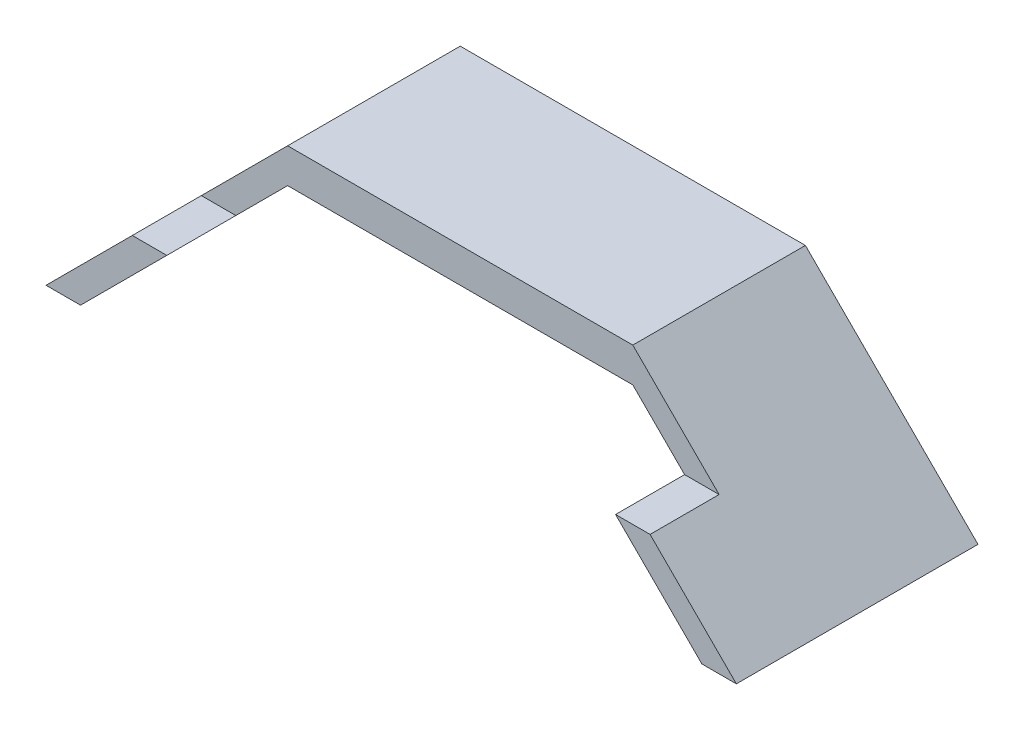
ISO-10303-21;
HEADER;
FILE_DESCRIPTION(('STEP AP214'),'2;1');
FILE_NAME('part.step','',(''),(''),'','','');
FILE_SCHEMA(('AUTOMOTIVE_DESIGN { 1 0 10303 214 1 1 1 1 }'));
ENDSEC;
DATA;
#1=APPLICATION_CONTEXT('core data for automotive mechanical design processes');
#2=APPLICATION_PROTOCOL_DEFINITION('international standard','automotive_design',2000,#1);
#3=PRODUCT_CONTEXT('',#1,'mechanical');
#4=PRODUCT('Part','Part','',(#3));
#5=PRODUCT_RELATED_PRODUCT_CATEGORY('part','',(#4));
#6=PRODUCT_DEFINITION_FORMATION('','',#4);
#7=PRODUCT_DEFINITION_CONTEXT('part definition',#1,'design');
#8=PRODUCT_DEFINITION('design','',#6,#7);
#9=PRODUCT_DEFINITION_SHAPE('','',#8);
#10=(LENGTH_UNIT() NAMED_UNIT(*) SI_UNIT(.MILLI.,.METRE.));
#11=(NAMED_UNIT(*) PLANE_ANGLE_UNIT() SI_UNIT($,.RADIAN.));
#12=(NAMED_UNIT(*) SI_UNIT($,.STERADIAN.) SOLID_ANGLE_UNIT());
#13=UNCERTAINTY_MEASURE_WITH_UNIT(LENGTH_MEASURE(1.E-05),#10,'distance_accuracy_value','');
#14=(GEOMETRIC_REPRESENTATION_CONTEXT(3) GLOBAL_UNCERTAINTY_ASSIGNED_CONTEXT((#13)) GLOBAL_UNIT_ASSIGNED_CONTEXT((#10,
#11,#12)) REPRESENTATION_CONTEXT('',''));
#15=CARTESIAN_POINT('',(0.,0.,0.));
#16=DIRECTION('',(0.,0.,1.));
#17=DIRECTION('',(1.,0.,0.));
#18=AXIS2_PLACEMENT_3D('',#15,#16,#17);
#19=CARTESIAN_POINT('',(-100.888329597959,66.3504106044676,70.));
#20=DIRECTION('',(0.,1.,0.));
#21=DIRECTION('',(-1.,0.,0.));
#22=AXIS2_PLACEMENT_3D('',#19,#20,#21);
#23=PLANE('',#22);
#24=DIRECTION('',(1.,0.,0.));
#25=VECTOR('',#24,1.);
#26=CARTESIAN_POINT('',(-100.888329597959,66.3504106044676,50.));
#27=LINE('',#26,#25);
#28=CARTESIAN_POINT('',(-100.888329597959,66.3504106044676,50.));
#29=VERTEX_POINT('',#28);
#30=CARTESIAN_POINT('',(-0.888329597958717,66.3504106044676,50.));
#31=VERTEX_POINT('',#30);
#32=EDGE_CURVE('E281',#29,#31,#27,.T.);
#33=ORIENTED_EDGE('',*,*,#32,.F.);
#34=DIRECTION('',(0.,0.,-1.));
#35=VECTOR('',#34,1.);
#36=CARTESIAN_POINT('',(-100.888329597959,66.3504106044676,70.));
#37=LINE('',#36,#35);
#38=CARTESIAN_POINT('',(-100.888329597959,66.3504106044676,0.));
#39=VERTEX_POINT('',#38);
#40=EDGE_CURVE('E11',#29,#39,#37,.T.);
#41=ORIENTED_EDGE('',*,*,#40,.T.);
#42=DIRECTION('',(1.,0.,0.));
#43=VECTOR('',#42,1.);
#44=CARTESIAN_POINT('',(-100.888329597959,66.3504106044676,0.));
#45=LINE('',#44,#43);
#46=CARTESIAN_POINT('',(-0.888329597958717,66.3504106044676,0.));
#47=VERTEX_POINT('',#46);
#48=EDGE_CURVE('E191',#39,#47,#45,.T.);
#49=ORIENTED_EDGE('',*,*,#48,.T.);
#50=DIRECTION('',(0.,0.,-1.));
#51=VECTOR('',#50,1.);
#52=CARTESIAN_POINT('',(-0.888329597958717,66.3504106044676,70.));
#53=LINE('',#52,#51);
#54=EDGE_CURVE('E47',#31,#47,#53,.T.);
#55=ORIENTED_EDGE('',*,*,#54,.F.);
#56=EDGE_LOOP('',(#33,#41,#49,#55));
#57=FACE_BOUND('',#56,.T.);
#58=ADVANCED_FACE('F38',(#57),#23,.F.);
#59=CARTESIAN_POINT('',(-100.888333902289,76.3504106044676,70.));
#60=DIRECTION('',(0.,-1.,0.));
#61=DIRECTION('',(0.,0.,-1.));
#62=AXIS2_PLACEMENT_3D('',#59,#60,#61);
#63=PLANE('',#62);
#64=DIRECTION('',(-1.,0.,0.));
#65=VECTOR('',#64,1.);
#66=CARTESIAN_POINT('',(-100.888333902289,76.3504106044676,50.));
#67=LINE('',#66,#65);
#68=CARTESIAN_POINT('',(-0.888333902288513,76.3504106044676,50.));
#69=VERTEX_POINT('',#68);
#70=CARTESIAN_POINT('',(-100.888333902289,76.3504106044676,50.));
#71=VERTEX_POINT('',#70);
#72=EDGE_CURVE('E150',#69,#71,#67,.T.);
#73=ORIENTED_EDGE('',*,*,#72,.F.);
#74=DIRECTION('',(0.,0.,-1.));
#75=VECTOR('',#74,1.);
#76=CARTESIAN_POINT('',(-0.888333902288513,76.3504106044676,70.));
#77=LINE('',#76,#75);
#78=CARTESIAN_POINT('',(-0.888333902288513,76.3504106044676,0.));
#79=VERTEX_POINT('',#78);
#80=EDGE_CURVE('E223',#69,#79,#77,.T.);
#81=ORIENTED_EDGE('',*,*,#80,.T.);
#82=DIRECTION('',(-1.,0.,0.));
#83=VECTOR('',#82,1.);
#84=CARTESIAN_POINT('',(-100.888333902289,76.3504106044676,0.));
#85=LINE('',#84,#83);
#86=CARTESIAN_POINT('',(-100.888333902289,76.3504106044676,0.));
#87=VERTEX_POINT('',#86);
#88=EDGE_CURVE('E206',#79,#87,#85,.T.);
#89=ORIENTED_EDGE('',*,*,#88,.T.);
#90=DIRECTION('',(0.,0.,-1.));
#91=VECTOR('',#90,1.);
#92=CARTESIAN_POINT('',(-100.888333902289,76.3504106044676,70.));
#93=LINE('',#92,#91);
#94=EDGE_CURVE('E220',#71,#87,#93,.T.);
#95=ORIENTED_EDGE('',*,*,#94,.F.);
#96=EDGE_LOOP('',(#73,#81,#89,#95));
#97=FACE_BOUND('',#96,.T.);
#98=ADVANCED_FACE('F303',(#97),#63,.F.);
#99=CARTESIAN_POINT('',(0.,0.,70.));
#100=DIRECTION('',(0.,0.,-1.));
#101=DIRECTION('',(-1.,0.,0.));
#102=AXIS2_PLACEMENT_3D('',#99,#100,#101);
#103=PLANE('',#102);
#104=DIRECTION('',(-0.707106811622753,0.70710675075034,0.));
#105=VECTOR('',#104,1.);
#106=CARTESIAN_POINT('',(49.1116704020413,26.3504106044676,70.));
#107=LINE('',#106,#105);
#108=CARTESIAN_POINT('',(49.1116704020413,26.3504106044676,70.));
#109=VERTEX_POINT('',#108);
#110=CARTESIAN_POINT('',(24.1116693259588,51.35041168055,70.));
#111=VERTEX_POINT('',#110);
#112=EDGE_CURVE('E178',#109,#111,#107,.T.);
#113=ORIENTED_EDGE('',*,*,#112,.T.);
#114=DIRECTION('',(1.,0.,0.));
#115=VECTOR('',#114,1.);
#116=CARTESIAN_POINT('',(14.1116693259588,51.35041168055,70.));
#117=LINE('',#116,#115);
#118=CARTESIAN_POINT('',(14.1116693259588,51.35041168055,70.));
#119=VERTEX_POINT('',#118);
#120=EDGE_CURVE('E154',#119,#111,#117,.T.);
#121=ORIENTED_EDGE('',*,*,#120,.F.);
#122=DIRECTION('',(0.707106781186547,-0.707106781186548,0.));
#123=VECTOR('',#122,1.);
#124=CARTESIAN_POINT('',(-0.888329597958717,66.3504106044676,70.));
#125=LINE('',#124,#123);
#126=CARTESIAN_POINT('',(39.1116704020413,26.3504106044676,70.));
#127=VERTEX_POINT('',#126);
#128=EDGE_CURVE('E103',#119,#127,#125,.T.);
#129=ORIENTED_EDGE('',*,*,#128,.T.);
#130=DIRECTION('',(1.,0.,0.));
#131=VECTOR('',#130,1.);
#132=CARTESIAN_POINT('',(39.1116704020413,26.3504106044676,70.));
#133=LINE('',#132,#131);
#134=EDGE_CURVE('E175',#127,#109,#133,.T.);
#135=ORIENTED_EDGE('',*,*,#134,.T.);
#136=EDGE_LOOP('',(#113,#121,#129,#135));
#137=FACE_BOUND('',#136,.T.);
#138=ADVANCED_FACE('F262',(#137),#103,.F.);
#139=CARTESIAN_POINT('',(-140.888329597959,26.3504106044676,70.));
#140=DIRECTION('',(-0.707106781186548,0.707106781186548,0.));
#141=DIRECTION('',(-0.707106781186548,-0.707106781186548,0.));
#142=AXIS2_PLACEMENT_3D('',#139,#140,#141);
#143=PLANE('',#142);
#144=DIRECTION('',(0.707106781186547,0.707106781186548,0.));
#145=VECTOR('',#144,1.);
#146=CARTESIAN_POINT('',(-100.888329597959,66.3504106044676,50.));
#147=LINE('',#146,#145);
#148=CARTESIAN_POINT('',(-115.888330674041,51.3504095283851,50.));
#149=VERTEX_POINT('',#148);
#150=EDGE_CURVE('E144',#149,#29,#147,.T.);
#151=ORIENTED_EDGE('',*,*,#150,.F.);
#152=DIRECTION('',(0.,0.,1.));
#153=VECTOR('',#152,1.);
#154=CARTESIAN_POINT('',(-115.888330674041,51.3504095283851,50.));
#155=LINE('',#154,#153);
#156=CARTESIAN_POINT('',(-115.888330674041,51.3504095283851,70.));
#157=VERTEX_POINT('',#156);
#158=EDGE_CURVE('E140',#149,#157,#155,.T.);
#159=ORIENTED_EDGE('',*,*,#158,.T.);
#160=DIRECTION('',(0.707106781186547,0.707106781186547,0.));
#161=VECTOR('',#160,1.);
#162=CARTESIAN_POINT('',(-140.888329597959,26.3504106044676,70.));
#163=LINE('',#162,#161);
#164=CARTESIAN_POINT('',(-140.888329597959,26.3504106044676,70.));
#165=VERTEX_POINT('',#164);
#166=EDGE_CURVE('E170',#165,#157,#163,.T.);
#167=ORIENTED_EDGE('',*,*,#166,.F.);
#168=DIRECTION('',(0.,0.,-1.));
#169=VECTOR('',#168,1.);
#170=CARTESIAN_POINT('',(-140.888329597959,26.3504106044676,70.));
#171=LINE('',#170,#169);
#172=CARTESIAN_POINT('',(-140.888329597959,26.3504106044676,0.));
#173=VERTEX_POINT('',#172);
#174=EDGE_CURVE('E186',#165,#173,#171,.T.);
#175=ORIENTED_EDGE('',*,*,#174,.T.);
#176=DIRECTION('',(0.707106781186547,0.707106781186547,0.));
#177=VECTOR('',#176,1.);
#178=CARTESIAN_POINT('',(-140.888329597959,26.3504106044676,0.));
#179=LINE('',#178,#177);
#180=EDGE_CURVE('E187',#173,#39,#179,.T.);
#181=ORIENTED_EDGE('',*,*,#180,.T.);
#182=ORIENTED_EDGE('',*,*,#40,.F.);
#183=EDGE_LOOP('',(#151,#159,#167,#175,#181,#182));
#184=FACE_BOUND('',#183,.T.);
#185=ADVANCED_FACE('F40',(#184),#143,.F.);
#186=CARTESIAN_POINT('',(-0.888329597958717,66.3504106044676,70.));
#187=DIRECTION('',(0.707106781186548,0.707106781186547,0.));
#188=DIRECTION('',(-0.707106781186547,0.707106781186548,0.));
#189=AXIS2_PLACEMENT_3D('',#186,#187,#188);
#190=PLANE('',#189);
#191=ORIENTED_EDGE('',*,*,#128,.F.);
#192=DIRECTION('',(0.,0.,1.));
#193=VECTOR('',#192,1.);
#194=CARTESIAN_POINT('',(14.1116693259588,51.35041168055,50.));
#195=LINE('',#194,#193);
#196=CARTESIAN_POINT('',(14.1116693259588,51.35041168055,50.));
#197=VERTEX_POINT('',#196);
#198=EDGE_CURVE('E164',#197,#119,#195,.T.);
#199=ORIENTED_EDGE('',*,*,#198,.F.);
#200=DIRECTION('',(0.707106781186548,-0.707106781186547,0.));
#201=VECTOR('',#200,1.);
#202=CARTESIAN_POINT('',(-0.888329597958717,66.3504106044676,50.));
#203=LINE('',#202,#201);
#204=EDGE_CURVE('E241',#31,#197,#203,.T.);
#205=ORIENTED_EDGE('',*,*,#204,.F.);
#206=ORIENTED_EDGE('',*,*,#54,.T.);
#207=DIRECTION('',(0.707106781186547,-0.707106781186548,0.));
#208=VECTOR('',#207,1.);
#209=CARTESIAN_POINT('',(-0.888329597958717,66.3504106044676,0.));
#210=LINE('',#209,#208);
#211=CARTESIAN_POINT('',(39.1116704020413,26.3504106044676,0.));
#212=VERTEX_POINT('',#211);
#213=EDGE_CURVE('E196',#47,#212,#210,.T.);
#214=ORIENTED_EDGE('',*,*,#213,.T.);
#215=DIRECTION('',(0.,0.,-1.));
#216=VECTOR('',#215,1.);
#217=CARTESIAN_POINT('',(39.1116704020413,26.3504106044676,70.));
#218=LINE('',#217,#216);
#219=EDGE_CURVE('E230',#127,#212,#218,.T.);
#220=ORIENTED_EDGE('',*,*,#219,.F.);
#221=EDGE_LOOP('',(#191,#199,#205,#206,#214,#220));
#222=FACE_BOUND('',#221,.T.);
#223=ADVANCED_FACE('F237',(#222),#190,.F.);
#224=CARTESIAN_POINT('',(39.1116704020413,26.3504106044676,70.));
#225=DIRECTION('',(0.,1.,0.));
#226=DIRECTION('',(0.,0.,1.));
#227=AXIS2_PLACEMENT_3D('',#224,#225,#226);
#228=PLANE('',#227);
#229=DIRECTION('',(1.,0.,0.));
#230=VECTOR('',#229,1.);
#231=CARTESIAN_POINT('',(39.1116704020413,26.3504106044676,0.));
#232=LINE('',#231,#230);
#233=CARTESIAN_POINT('',(49.1116704020413,26.3504106044676,0.));
#234=VERTEX_POINT('',#233);
#235=EDGE_CURVE('E199',#212,#234,#232,.T.);
#236=ORIENTED_EDGE('',*,*,#235,.T.);
#237=DIRECTION('',(0.,0.,-1.));
#238=VECTOR('',#237,1.);
#239=CARTESIAN_POINT('',(49.1116704020413,26.3504106044676,70.));
#240=LINE('',#239,#238);
#241=EDGE_CURVE('E226',#109,#234,#240,.T.);
#242=ORIENTED_EDGE('',*,*,#241,.F.);
#243=ORIENTED_EDGE('',*,*,#134,.F.);
#244=ORIENTED_EDGE('',*,*,#219,.T.);
#245=EDGE_LOOP('',(#236,#242,#243,#244));
#246=FACE_BOUND('',#245,.T.);
#247=ADVANCED_FACE('F254',(#246),#228,.F.);
#248=CARTESIAN_POINT('',(49.1116704020413,26.3504106044676,70.));
#249=DIRECTION('',(-0.70710675075034,-0.707106811622753,0.));
#250=DIRECTION('',(0.707106811622753,-0.70710675075034,0.));
#251=AXIS2_PLACEMENT_3D('',#248,#249,#250);
#252=PLANE('',#251);
#253=DIRECTION('',(-0.707106842058958,0.707106720314132,0.));
#254=VECTOR('',#253,1.);
#255=CARTESIAN_POINT('',(24.1116693259588,51.35041168055,50.));
#256=LINE('',#255,#254);
#257=CARTESIAN_POINT('',(24.1116693259588,51.35041168055,50.));
#258=VERTEX_POINT('',#257);
#259=EDGE_CURVE('E166',#258,#69,#256,.T.);
#260=ORIENTED_EDGE('',*,*,#259,.F.);
#261=DIRECTION('',(0.,0.,1.));
#262=VECTOR('',#261,1.);
#263=CARTESIAN_POINT('',(24.1116693259588,51.35041168055,50.));
#264=LINE('',#263,#262);
#265=EDGE_CURVE('E192',#258,#111,#264,.T.);
#266=ORIENTED_EDGE('',*,*,#265,.T.);
#267=ORIENTED_EDGE('',*,*,#112,.F.);
#268=ORIENTED_EDGE('',*,*,#241,.T.);
#269=DIRECTION('',(-0.707106811622753,0.70710675075034,0.));
#270=VECTOR('',#269,1.);
#271=CARTESIAN_POINT('',(49.1116704020413,26.3504106044676,0.));
#272=LINE('',#271,#270);
#273=EDGE_CURVE('E202',#234,#79,#272,.T.);
#274=ORIENTED_EDGE('',*,*,#273,.T.);
#275=ORIENTED_EDGE('',*,*,#80,.F.);
#276=EDGE_LOOP('',(#260,#266,#267,#268,#274,#275));
#277=FACE_BOUND('',#276,.T.);
#278=ADVANCED_FACE('F259',(#277),#252,.F.);
#279=CARTESIAN_POINT('',(-150.888329597959,26.3504106044676,70.));
#280=DIRECTION('',(0.707106811622756,-0.707106750750338,0.));
#281=DIRECTION('',(0.707106750750338,0.707106811622756,0.));
#282=AXIS2_PLACEMENT_3D('',#279,#280,#281);
#283=PLANE('',#282);
#284=DIRECTION('',(-0.707106750750338,-0.707106811622756,0.));
#285=VECTOR('',#284,1.);
#286=CARTESIAN_POINT('',(-150.888329597959,26.3504106044676,70.));
#287=LINE('',#286,#285);
#288=CARTESIAN_POINT('',(-125.888332826206,51.3504095283851,70.));
#289=VERTEX_POINT('',#288);
#290=CARTESIAN_POINT('',(-150.888329597959,26.3504106044676,70.));
#291=VERTEX_POINT('',#290);
#292=EDGE_CURVE('E159',#289,#291,#287,.T.);
#293=ORIENTED_EDGE('',*,*,#292,.F.);
#294=DIRECTION('',(0.,0.,1.));
#295=VECTOR('',#294,1.);
#296=CARTESIAN_POINT('',(-125.888330674041,51.3504095283851,50.));
#297=LINE('',#296,#295);
#298=CARTESIAN_POINT('',(-125.888330674041,51.3504095283851,50.));
#299=VERTEX_POINT('',#298);
#300=EDGE_CURVE('E54',#299,#289,#297,.T.);
#301=ORIENTED_EDGE('',*,*,#300,.F.);
#302=DIRECTION('',(-0.707106720314127,-0.707106842058963,0.));
#303=VECTOR('',#302,1.);
#304=CARTESIAN_POINT('',(-125.888330674041,51.3504095283851,50.));
#305=LINE('',#304,#303);
#306=EDGE_CURVE('E145',#71,#299,#305,.T.);
#307=ORIENTED_EDGE('',*,*,#306,.F.);
#308=ORIENTED_EDGE('',*,*,#94,.T.);
#309=DIRECTION('',(-0.707106750750338,-0.707106811622756,0.));
#310=VECTOR('',#309,1.);
#311=CARTESIAN_POINT('',(-150.888329597959,26.3504106044676,0.));
#312=LINE('',#311,#310);
#313=CARTESIAN_POINT('',(-150.888329597959,26.3504106044676,0.));
#314=VERTEX_POINT('',#313);
#315=EDGE_CURVE('E210',#87,#314,#312,.T.);
#316=ORIENTED_EDGE('',*,*,#315,.T.);
#317=DIRECTION('',(0.,0.,-1.));
#318=VECTOR('',#317,1.);
#319=CARTESIAN_POINT('',(-150.888329597959,26.3504106044676,70.));
#320=LINE('',#319,#318);
#321=EDGE_CURVE('E217',#291,#314,#320,.T.);
#322=ORIENTED_EDGE('',*,*,#321,.F.);
#323=EDGE_LOOP('',(#293,#301,#307,#308,#316,#322));
#324=FACE_BOUND('',#323,.T.);
#325=ADVANCED_FACE('F157',(#324),#283,.F.);
#326=CARTESIAN_POINT('',(-150.888329597959,26.3504106044676,70.));
#327=DIRECTION('',(0.,1.,0.));
#328=DIRECTION('',(0.,0.,1.));
#329=AXIS2_PLACEMENT_3D('',#326,#327,#328);
#330=PLANE('',#329);
#331=DIRECTION('',(1.,0.,0.));
#332=VECTOR('',#331,1.);
#333=CARTESIAN_POINT('',(-150.888329597959,26.3504106044676,0.));
#334=LINE('',#333,#332);
#335=EDGE_CURVE('E95',#314,#173,#334,.T.);
#336=ORIENTED_EDGE('',*,*,#335,.T.);
#337=ORIENTED_EDGE('',*,*,#174,.F.);
#338=DIRECTION('',(1.,0.,0.));
#339=VECTOR('',#338,1.);
#340=CARTESIAN_POINT('',(-150.888329597959,26.3504106044676,70.));
#341=LINE('',#340,#339);
#342=EDGE_CURVE('E63',#291,#165,#341,.T.);
#343=ORIENTED_EDGE('',*,*,#342,.F.);
#344=ORIENTED_EDGE('',*,*,#321,.T.);
#345=EDGE_LOOP('',(#336,#337,#343,#344));
#346=FACE_BOUND('',#345,.T.);
#347=ADVANCED_FACE('F288',(#346),#330,.F.);
#348=ORIENTED_EDGE('',*,*,#166,.T.);
#349=DIRECTION('',(1.,0.,0.));
#350=VECTOR('',#349,1.);
#351=CARTESIAN_POINT('',(-125.888330674041,51.3504095283851,70.));
#352=LINE('',#351,#350);
#353=EDGE_CURVE('E265',#289,#157,#352,.T.);
#354=ORIENTED_EDGE('',*,*,#353,.F.);
#355=ORIENTED_EDGE('',*,*,#292,.T.);
#356=ORIENTED_EDGE('',*,*,#342,.T.);
#357=EDGE_LOOP('',(#348,#354,#355,#356));
#358=FACE_BOUND('',#357,.T.);
#359=ADVANCED_FACE('F289',(#358),#103,.F.);
#360=CARTESIAN_POINT('',(0.,0.,0.));
#361=DIRECTION('',(0.,0.,-1.));
#362=DIRECTION('',(-1.,0.,0.));
#363=AXIS2_PLACEMENT_3D('',#360,#361,#362);
#364=PLANE('',#363);
#365=ORIENTED_EDGE('',*,*,#180,.F.);
#366=ORIENTED_EDGE('',*,*,#335,.F.);
#367=ORIENTED_EDGE('',*,*,#315,.F.);
#368=ORIENTED_EDGE('',*,*,#88,.F.);
#369=ORIENTED_EDGE('',*,*,#273,.F.);
#370=ORIENTED_EDGE('',*,*,#235,.F.);
#371=ORIENTED_EDGE('',*,*,#213,.F.);
#372=ORIENTED_EDGE('',*,*,#48,.F.);
#373=EDGE_LOOP('',(#365,#366,#367,#368,#369,#370,#371,#372));
#374=FACE_BOUND('',#373,.T.);
#375=ADVANCED_FACE('F249',(#374),#364,.T.);
#376=CARTESIAN_POINT('',(14.1116693259588,51.35041168055,50.));
#377=DIRECTION('',(0.,-1.,0.));
#378=DIRECTION('',(0.,0.,-1.));
#379=AXIS2_PLACEMENT_3D('',#376,#377,#378);
#380=PLANE('',#379);
#381=ORIENTED_EDGE('',*,*,#120,.T.);
#382=ORIENTED_EDGE('',*,*,#265,.F.);
#383=DIRECTION('',(1.,0.,0.));
#384=VECTOR('',#383,1.);
#385=CARTESIAN_POINT('',(14.1116693259588,51.35041168055,50.));
#386=LINE('',#385,#384);
#387=EDGE_CURVE('E275',#197,#258,#386,.T.);
#388=ORIENTED_EDGE('',*,*,#387,.F.);
#389=ORIENTED_EDGE('',*,*,#198,.T.);
#390=EDGE_LOOP('',(#381,#382,#388,#389));
#391=FACE_BOUND('',#390,.T.);
#392=ADVANCED_FACE('F297',(#391),#380,.F.);
#393=CARTESIAN_POINT('',(-125.888330674041,51.3504095283851,50.));
#394=DIRECTION('',(0.,-1.,0.));
#395=DIRECTION('',(0.,0.,-1.));
#396=AXIS2_PLACEMENT_3D('',#393,#394,#395);
#397=PLANE('',#396);
#398=ORIENTED_EDGE('',*,*,#353,.T.);
#399=ORIENTED_EDGE('',*,*,#158,.F.);
#400=DIRECTION('',(1.,0.,0.));
#401=VECTOR('',#400,1.);
#402=CARTESIAN_POINT('',(-125.888330674041,51.3504095283851,50.));
#403=LINE('',#402,#401);
#404=EDGE_CURVE('E136',#299,#149,#403,.T.);
#405=ORIENTED_EDGE('',*,*,#404,.F.);
#406=ORIENTED_EDGE('',*,*,#300,.T.);
#407=EDGE_LOOP('',(#398,#399,#405,#406));
#408=FACE_BOUND('',#407,.T.);
#409=ADVANCED_FACE('F138',(#408),#397,.F.);
#410=CARTESIAN_POINT('',(0.,0.,50.));
#411=DIRECTION('',(0.,0.,1.));
#412=DIRECTION('',(1.,0.,0.));
#413=AXIS2_PLACEMENT_3D('',#410,#411,#412);
#414=PLANE('',#413);
#415=ORIENTED_EDGE('',*,*,#306,.T.);
#416=ORIENTED_EDGE('',*,*,#404,.T.);
#417=ORIENTED_EDGE('',*,*,#150,.T.);
#418=ORIENTED_EDGE('',*,*,#32,.T.);
#419=ORIENTED_EDGE('',*,*,#204,.T.);
#420=ORIENTED_EDGE('',*,*,#387,.T.);
#421=ORIENTED_EDGE('',*,*,#259,.T.);
#422=ORIENTED_EDGE('',*,*,#72,.T.);
#423=EDGE_LOOP('',(#415,#416,#417,#418,#419,#420,#421,#422));
#424=FACE_BOUND('',#423,.T.);
#425=ADVANCED_FACE('F148',(#424),#414,.T.);
#426=CLOSED_SHELL('',(#58,#98,#138,#185,#223,#247,#278,#325,#347,#359,#375,#392,#409,#425));
#427=MANIFOLD_SOLID_BREP('B2',#426);
#428=ADVANCED_BREP_SHAPE_REPRESENTATION('',(#18,#427),#14);
#429=SHAPE_DEFINITION_REPRESENTATION(#9,#428);
ENDSEC;
END-ISO-10303-21;
